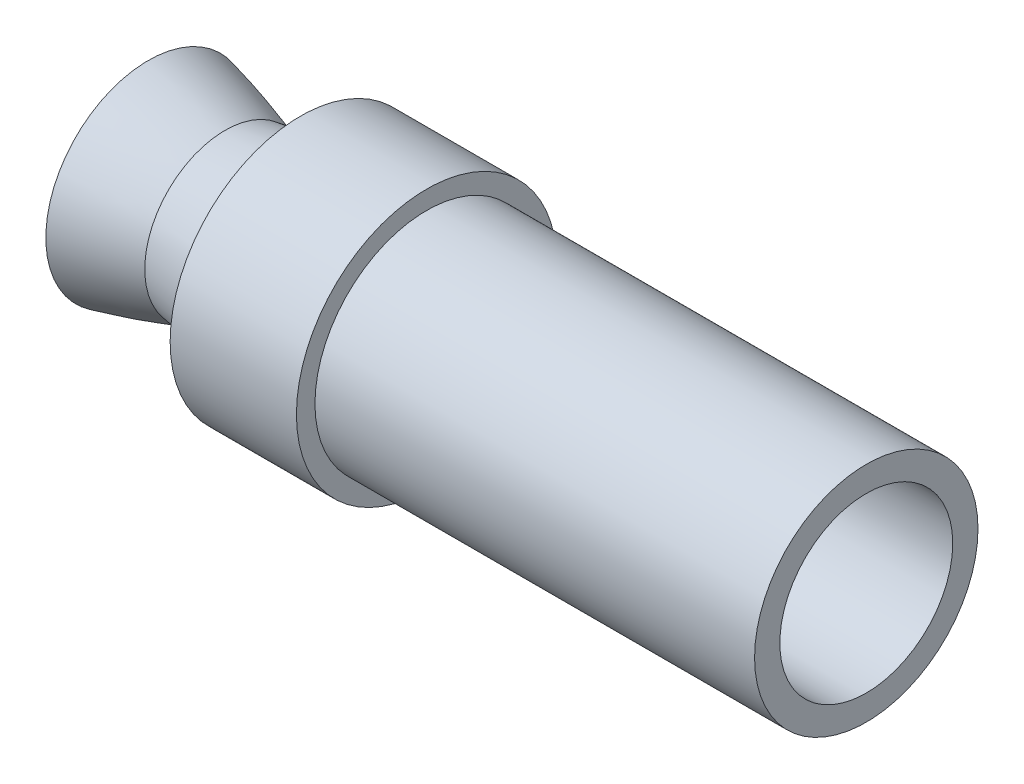
ISO-10303-21;
HEADER;
FILE_DESCRIPTION(('STEP AP214'),'2;1');
FILE_NAME('part.step','',(''),(''),'','','');
FILE_SCHEMA(('AUTOMOTIVE_DESIGN { 1 0 10303 214 1 1 1 1 }'));
ENDSEC;
DATA;
#1=APPLICATION_CONTEXT('core data for automotive mechanical design processes');
#2=APPLICATION_PROTOCOL_DEFINITION('international standard','automotive_design',2000,#1);
#3=PRODUCT_CONTEXT('',#1,'mechanical');
#4=PRODUCT('Part','Part','',(#3));
#5=PRODUCT_RELATED_PRODUCT_CATEGORY('part','',(#4));
#6=PRODUCT_DEFINITION_FORMATION('','',#4);
#7=PRODUCT_DEFINITION_CONTEXT('part definition',#1,'design');
#8=PRODUCT_DEFINITION('design','',#6,#7);
#9=PRODUCT_DEFINITION_SHAPE('','',#8);
#10=(LENGTH_UNIT() NAMED_UNIT(*) SI_UNIT(.MILLI.,.METRE.));
#11=(NAMED_UNIT(*) PLANE_ANGLE_UNIT() SI_UNIT($,.RADIAN.));
#12=(NAMED_UNIT(*) SI_UNIT($,.STERADIAN.) SOLID_ANGLE_UNIT());
#13=UNCERTAINTY_MEASURE_WITH_UNIT(LENGTH_MEASURE(1.E-05),#10,'distance_accuracy_value','');
#14=(GEOMETRIC_REPRESENTATION_CONTEXT(3) GLOBAL_UNCERTAINTY_ASSIGNED_CONTEXT((#13)) GLOBAL_UNIT_ASSIGNED_CONTEXT((#10,
#11,#12)) REPRESENTATION_CONTEXT('',''));
#15=CARTESIAN_POINT('',(0.,0.,0.));
#16=DIRECTION('',(0.,0.,1.));
#17=DIRECTION('',(1.,0.,0.));
#18=AXIS2_PLACEMENT_3D('',#15,#16,#17);
#19=CARTESIAN_POINT('',(28.9492369333014,0.,0.));
#20=DIRECTION('',(1.,0.,0.));
#21=DIRECTION('',(0.,0.,-1.));
#22=AXIS2_PLACEMENT_3D('',#19,#20,#21);
#23=DEGENERATE_TOROIDAL_SURFACE('',#22,17.3860040166505,18.,.T.);
#24=CARTESIAN_POINT('',(16.2213148719435,0.,0.));
#25=DIRECTION('',(1.,0.,0.));
#26=DIRECTION('',(0.,0.,-1.));
#27=AXIS2_PLACEMENT_3D('',#24,#25,#26);
#28=CIRCLE('',#27,30.1139260780083);
#29=CARTESIAN_POINT('',(16.2213148719435,0.,-30.1139260780083));
#30=VERTEX_POINT('',#29);
#31=EDGE_CURVE('E80',#30,#30,#28,.T.);
#32=ORIENTED_EDGE('',*,*,#31,.F.);
#33=EDGE_LOOP('',(#32));
#34=FACE_BOUND('',#33,.T.);
#35=CARTESIAN_POINT('',(28.9492369333014,0.,0.));
#36=DIRECTION('',(1.,0.,0.));
#37=DIRECTION('',(0.,0.,-1.));
#38=AXIS2_PLACEMENT_3D('',#35,#36,#37);
#39=CIRCLE('',#38,35.3860040166505);
#40=CARTESIAN_POINT('',(28.9492369333014,0.,-35.3860040166505));
#41=VERTEX_POINT('',#40);
#42=EDGE_CURVE('E11',#41,#41,#39,.T.);
#43=ORIENTED_EDGE('',*,*,#42,.T.);
#44=EDGE_LOOP('',(#43));
#45=FACE_BOUND('',#44,.T.);
#46=ADVANCED_FACE('F53',(#34,#45),#23,.F.);
#47=CARTESIAN_POINT('',(0.,0.,0.));
#48=DIRECTION('',(1.,0.,0.));
#49=DIRECTION('',(0.,0.,-1.));
#50=AXIS2_PLACEMENT_3D('',#47,#48,#49);
#51=CYLINDRICAL_SURFACE('',#50,35.3860040166505);
#52=ORIENTED_EDGE('',*,*,#42,.F.);
#53=EDGE_LOOP('',(#52));
#54=FACE_BOUND('',#53,.T.);
#55=CARTESIAN_POINT('',(49.8781691214359,0.,0.));
#56=DIRECTION('',(1.,0.,0.));
#57=DIRECTION('',(0.,0.,-1.));
#58=AXIS2_PLACEMENT_3D('',#55,#56,#57);
#59=CIRCLE('',#58,35.3860040166505);
#60=CARTESIAN_POINT('',(49.8781691214359,0.,-35.3860040166505));
#61=VERTEX_POINT('',#60);
#62=EDGE_CURVE('E60',#61,#61,#59,.T.);
#63=ORIENTED_EDGE('',*,*,#62,.T.);
#64=EDGE_LOOP('',(#63));
#65=FACE_BOUND('',#64,.T.);
#66=ADVANCED_FACE('F88',(#54,#65),#51,.F.);
#67=CARTESIAN_POINT('',(49.8781691214359,0.,0.));
#68=DIRECTION('',(-1.,0.,0.));
#69=DIRECTION('',(0.,0.,1.));
#70=AXIS2_PLACEMENT_3D('',#67,#68,#69);
#71=PLANE('',#70);
#72=ORIENTED_EDGE('',*,*,#62,.F.);
#73=EDGE_LOOP('',(#72));
#74=FACE_BOUND('',#73,.T.);
#75=CARTESIAN_POINT('',(49.8781691214359,0.,0.));
#76=DIRECTION('',(1.,0.,0.));
#77=DIRECTION('',(0.,0.,-1.));
#78=AXIS2_PLACEMENT_3D('',#75,#76,#77);
#79=CIRCLE('',#78,41.2499999999755);
#80=CARTESIAN_POINT('',(49.8781691214359,0.,-41.2499999999755));
#81=VERTEX_POINT('',#80);
#82=EDGE_CURVE('E65',#81,#81,#79,.T.);
#83=ORIENTED_EDGE('',*,*,#82,.T.);
#84=EDGE_LOOP('',(#83));
#85=FACE_BOUND('',#84,.T.);
#86=ADVANCED_FACE('F92',(#74,#85),#71,.F.);
#87=CARTESIAN_POINT('',(0.,0.,0.));
#88=DIRECTION('',(1.,0.,0.));
#89=DIRECTION('',(0.,0.,-1.));
#90=AXIS2_PLACEMENT_3D('',#87,#88,#89);
#91=CYLINDRICAL_SURFACE('',#90,41.2499999999755);
#92=ORIENTED_EDGE('',*,*,#82,.F.);
#93=EDGE_LOOP('',(#92));
#94=FACE_BOUND('',#93,.T.);
#95=CARTESIAN_POINT('',(9.87816912143587,0.,0.));
#96=DIRECTION('',(1.,0.,0.));
#97=DIRECTION('',(0.,0.,-1.));
#98=AXIS2_PLACEMENT_3D('',#95,#96,#97);
#99=CIRCLE('',#98,41.2499999999755);
#100=CARTESIAN_POINT('',(9.87816912143587,0.,-41.2499999999755));
#101=VERTEX_POINT('',#100);
#102=EDGE_CURVE('E70',#101,#101,#99,.T.);
#103=ORIENTED_EDGE('',*,*,#102,.T.);
#104=EDGE_LOOP('',(#103));
#105=FACE_BOUND('',#104,.T.);
#106=ADVANCED_FACE('F97',(#94,#105),#91,.T.);
#107=CARTESIAN_POINT('',(9.87816912143587,0.,0.));
#108=DIRECTION('',(1.,0.,0.));
#109=DIRECTION('',(0.,0.,-1.));
#110=AXIS2_PLACEMENT_3D('',#107,#108,#109);
#111=PLANE('',#110);
#112=ORIENTED_EDGE('',*,*,#102,.F.);
#113=EDGE_LOOP('',(#112));
#114=FACE_BOUND('',#113,.T.);
#115=CARTESIAN_POINT('',(9.87816912143588,0.,0.));
#116=DIRECTION('',(1.,0.,0.));
#117=DIRECTION('',(0.,0.,-1.));
#118=AXIS2_PLACEMENT_3D('',#115,#116,#117);
#119=CIRCLE('',#118,29.1318255412281);
#120=CARTESIAN_POINT('',(9.87816912143588,0.,-29.1318255412281));
#121=VERTEX_POINT('',#120);
#122=EDGE_CURVE('E76',#121,#121,#119,.T.);
#123=ORIENTED_EDGE('',*,*,#122,.T.);
#124=EDGE_LOOP('',(#123));
#125=FACE_BOUND('',#124,.T.);
#126=ADVANCED_FACE('F103',(#114,#125),#111,.F.);
#127=CARTESIAN_POINT('',(16.2213148719435,0.,0.));
#128=DIRECTION('',(1.,0.,0.));
#129=DIRECTION('',(0.,0.,-1.));
#130=AXIS2_PLACEMENT_3D('',#127,#128,#129);
#131=CONICAL_SURFACE('',#130,30.1139260780083,0.153608941783486);
#132=ORIENTED_EDGE('',*,*,#122,.F.);
#133=EDGE_LOOP('',(#132));
#134=FACE_BOUND('',#133,.T.);
#135=ORIENTED_EDGE('',*,*,#31,.T.);
#136=EDGE_LOOP('',(#135));
#137=FACE_BOUND('',#136,.T.);
#138=ADVANCED_FACE('F85',(#134,#137),#131,.F.);
#139=CLOSED_SHELL('',(#46,#66,#86,#106,#126,#138));
#140=MANIFOLD_SOLID_BREP('B2',#139);
#141=CARTESIAN_POINT('',(16.2213148719435,0.,0.));
#142=DIRECTION('',(1.,0.,0.));
#143=DIRECTION('',(0.,0.,-1.));
#144=AXIS2_PLACEMENT_3D('',#141,#142,#143);
#145=CONICAL_SURFACE('',#144,30.1139260780083,0.153608941783486);
#146=CARTESIAN_POINT('',(-13.9815869337929,0.,0.));
#147=DIRECTION('',(1.,0.,0.));
#148=DIRECTION('',(0.,0.,-1.));
#149=AXIS2_PLACEMENT_3D('',#146,#147,#148);
#150=CIRCLE('',#149,25.4376523106333);
#151=CARTESIAN_POINT('',(-13.9815869337929,0.,-25.4376523106333));
#152=VERTEX_POINT('',#151);
#153=EDGE_CURVE('E52',#152,#152,#150,.T.);
#154=ORIENTED_EDGE('',*,*,#153,.T.);
#155=EDGE_LOOP('',(#154));
#156=FACE_BOUND('',#155,.T.);
#157=CARTESIAN_POINT('',(16.2213148719435,0.,0.));
#158=DIRECTION('',(1.,0.,0.));
#159=DIRECTION('',(0.,0.,-1.));
#160=AXIS2_PLACEMENT_3D('',#157,#158,#159);
#161=CIRCLE('',#160,30.1139260780083);
#162=CARTESIAN_POINT('',(16.2213148719435,0.,-30.1139260780083));
#163=VERTEX_POINT('',#162);
#164=EDGE_CURVE('E202',#163,#163,#161,.T.);
#165=ORIENTED_EDGE('',*,*,#164,.F.);
#166=EDGE_LOOP('',(#165));
#167=FACE_BOUND('',#166,.T.);
#168=ADVANCED_FACE('F162',(#156,#167),#145,.T.);
#169=CARTESIAN_POINT('',(2.34818467411675,19.2267693994655,0.));
#170=CARTESIAN_POINT('',(0.31354563692423,20.0775060385211,0.));
#171=CARTESIAN_POINT('',(-5.8002726091552,22.5182343127452,0.));
#172=CARTESIAN_POINT('',(-13.9783879953932,25.4749777747112,0.));
#173=CARTESIAN_POINT('',(-28.1601907718546,30.0701216733316,0.));
#174=CARTESIAN_POINT('',(-38.3150228285927,32.4320922392603,0.));
#175=B_SPLINE_CURVE_WITH_KNOTS('',2,(#169,#170,#171,#172,#173,#174),.UNSPECIFIED.,.F.,.F.,(3,1,
1,1,3),(0.018493807027929,0.117487589472404,0.315475154361354,0.513462719250305,1.),.UNSPECIFIED.);
#176=CARTESIAN_POINT('',(0.,0.,0.));
#177=DIRECTION('',(1.,0.,0.));
#178=AXIS1_PLACEMENT('',#176,#177);
#179=SURFACE_OF_REVOLUTION('',#175,#178);
#180=CARTESIAN_POINT('',(-38.3150228285927,0.,0.));
#181=DIRECTION('',(1.,0.,0.));
#182=DIRECTION('',(0.,0.,-1.));
#183=AXIS2_PLACEMENT_3D('',#180,#181,#182);
#184=CIRCLE('',#183,32.4320922392603);
#185=CARTESIAN_POINT('',(-38.3150228285927,0.,-32.4320922392603));
#186=VERTEX_POINT('',#185);
#187=EDGE_CURVE('E168',#186,#186,#184,.T.);
#188=ORIENTED_EDGE('',*,*,#187,.T.);
#189=EDGE_LOOP('',(#188));
#190=FACE_BOUND('',#189,.T.);
#191=ORIENTED_EDGE('',*,*,#153,.F.);
#192=EDGE_LOOP('',(#191));
#193=FACE_BOUND('',#192,.T.);
#194=ADVANCED_FACE('F225',(#190,#193),#179,.F.);
#195=CARTESIAN_POINT('',(-40.1270102829806,0.,0.));
#196=DIRECTION('',(1.,0.,0.));
#197=DIRECTION('',(0.,0.,-1.));
#198=AXIS2_PLACEMENT_3D('',#195,#196,#197);
#199=CONICAL_SURFACE('',#198,24.64,1.34231515229828);
#200=ORIENTED_EDGE('',*,*,#187,.F.);
#201=EDGE_LOOP('',(#200));
#202=FACE_BOUND('',#201,.T.);
#203=CARTESIAN_POINT('',(-40.1270102829806,0.,0.));
#204=DIRECTION('',(1.,0.,0.));
#205=DIRECTION('',(0.,0.,-1.));
#206=AXIS2_PLACEMENT_3D('',#203,#204,#205);
#207=CIRCLE('',#206,24.64);
#208=CARTESIAN_POINT('',(-40.1270102829806,0.,-24.64));
#209=VERTEX_POINT('',#208);
#210=EDGE_CURVE('E172',#209,#209,#207,.T.);
#211=ORIENTED_EDGE('',*,*,#210,.T.);
#212=EDGE_LOOP('',(#211));
#213=FACE_BOUND('',#212,.T.);
#214=ADVANCED_FACE('F221',(#202,#213),#199,.T.);
#215=CARTESIAN_POINT('',(0.,11.5361374682942,0.));
#216=CARTESIAN_POINT('',(-19.9482573544596,19.9475956971547,0.));
#217=CARTESIAN_POINT('',(-40.1270102829806,24.64,0.));
#218=B_SPLINE_CURVE_WITH_KNOTS('',2,(#215,#216,#217),.UNSPECIFIED.,.F.,.F.,(3,3),(0.,1.),.UNSPECIFIED.);
#219=CARTESIAN_POINT('',(0.,0.,0.));
#220=DIRECTION('',(1.,0.,0.));
#221=AXIS1_PLACEMENT('',#219,#220);
#222=SURFACE_OF_REVOLUTION('',#218,#221);
#223=ORIENTED_EDGE('',*,*,#210,.F.);
#224=EDGE_LOOP('',(#223));
#225=FACE_BOUND('',#224,.T.);
#226=CARTESIAN_POINT('',(0.,0.,0.));
#227=DIRECTION('',(1.,0.,0.));
#228=DIRECTION('',(0.,0.,-1.));
#229=AXIS2_PLACEMENT_3D('',#226,#227,#228);
#230=CIRCLE('',#229,11.5361374682942);
#231=CARTESIAN_POINT('',(0.,0.,-11.5361374682942));
#232=VERTEX_POINT('',#231);
#233=EDGE_CURVE('E176',#232,#232,#230,.T.);
#234=ORIENTED_EDGE('',*,*,#233,.T.);
#235=EDGE_LOOP('',(#234));
#236=FACE_BOUND('',#235,.T.);
#237=ADVANCED_FACE('F216',(#225,#236),#222,.T.);
#238=CARTESIAN_POINT('',(1.66230944505193,0.,0.));
#239=DIRECTION('',(1.,0.,0.));
#240=DIRECTION('',(0.,0.,-1.));
#241=AXIS2_PLACEMENT_3D('',#238,#239,#240);
#242=TOROIDAL_SURFACE('',#241,15.4784,4.2784);
#243=ORIENTED_EDGE('',*,*,#233,.F.);
#244=EDGE_LOOP('',(#243));
#245=FACE_BOUND('',#244,.T.);
#246=CARTESIAN_POINT('',(1.66230944505193,0.,0.));
#247=DIRECTION('',(1.,0.,0.));
#248=DIRECTION('',(0.,0.,-1.));
#249=AXIS2_PLACEMENT_3D('',#246,#247,#248);
#250=CIRCLE('',#249,11.2);
#251=CARTESIAN_POINT('',(1.66230944505193,0.,-11.2));
#252=VERTEX_POINT('',#251);
#253=EDGE_CURVE('E181',#252,#252,#250,.T.);
#254=ORIENTED_EDGE('',*,*,#253,.T.);
#255=EDGE_LOOP('',(#254));
#256=FACE_BOUND('',#255,.T.);
#257=ADVANCED_FACE('F220',(#245,#256),#242,.T.);
#258=CARTESIAN_POINT('',(1.66230944505193,0.,0.));
#259=DIRECTION('',(1.,0.,0.));
#260=DIRECTION('',(0.,0.,-1.));
#261=AXIS2_PLACEMENT_3D('',#258,#259,#260);
#262=TOROIDAL_SURFACE('',#261,28.,16.8);
#263=ORIENTED_EDGE('',*,*,#253,.F.);
#264=EDGE_LOOP('',(#263));
#265=FACE_BOUND('',#264,.T.);
#266=CARTESIAN_POINT('',(13.5417033689859,0.,0.));
#267=DIRECTION('',(1.,0.,0.));
#268=DIRECTION('',(0.,0.,-1.));
#269=AXIS2_PLACEMENT_3D('',#266,#267,#268);
#270=CIRCLE('',#269,16.120606076066);
#271=CARTESIAN_POINT('',(13.5417033689859,0.,-16.120606076066));
#272=VERTEX_POINT('',#271);
#273=EDGE_CURVE('E184',#272,#272,#270,.T.);
#274=ORIENTED_EDGE('',*,*,#273,.T.);
#275=EDGE_LOOP('',(#274));
#276=FACE_BOUND('',#275,.T.);
#277=ADVANCED_FACE('F269',(#265,#276),#262,.T.);
#278=CARTESIAN_POINT('',(21.8781691214359,0.,0.));
#279=DIRECTION('',(1.,0.,0.));
#280=DIRECTION('',(0.,0.,-1.));
#281=AXIS2_PLACEMENT_3D('',#278,#279,#280);
#282=CONICAL_SURFACE('',#281,24.457071828516,0.785398163397449);
#283=ORIENTED_EDGE('',*,*,#273,.F.);
#284=EDGE_LOOP('',(#283));
#285=FACE_BOUND('',#284,.T.);
#286=CARTESIAN_POINT('',(21.8781691214359,0.,0.));
#287=DIRECTION('',(1.,0.,0.));
#288=DIRECTION('',(0.,0.,-1.));
#289=AXIS2_PLACEMENT_3D('',#286,#287,#288);
#290=CIRCLE('',#289,24.457071828516);
#291=CARTESIAN_POINT('',(21.8781691214359,0.,-24.457071828516));
#292=VERTEX_POINT('',#291);
#293=EDGE_CURVE('E187',#292,#292,#290,.T.);
#294=ORIENTED_EDGE('',*,*,#293,.T.);
#295=EDGE_LOOP('',(#294));
#296=FACE_BOUND('',#295,.T.);
#297=ADVANCED_FACE('F263',(#285,#296),#282,.F.);
#298=CARTESIAN_POINT('',(28.9492369333014,0.,0.));
#299=DIRECTION('',(1.,0.,0.));
#300=DIRECTION('',(0.,0.,-1.));
#301=AXIS2_PLACEMENT_3D('',#298,#299,#300);
#302=TOROIDAL_SURFACE('',#301,17.3860040166505,10.);
#303=ORIENTED_EDGE('',*,*,#293,.F.);
#304=EDGE_LOOP('',(#303));
#305=FACE_BOUND('',#304,.T.);
#306=CARTESIAN_POINT('',(28.9492369333014,0.,0.));
#307=DIRECTION('',(1.,0.,0.));
#308=DIRECTION('',(0.,0.,-1.));
#309=AXIS2_PLACEMENT_3D('',#306,#307,#308);
#310=CIRCLE('',#309,27.3860040166505);
#311=CARTESIAN_POINT('',(28.9492369333014,0.,-27.3860040166505));
#312=VERTEX_POINT('',#311);
#313=EDGE_CURVE('E190',#312,#312,#310,.T.);
#314=ORIENTED_EDGE('',*,*,#313,.T.);
#315=EDGE_LOOP('',(#314));
#316=FACE_BOUND('',#315,.T.);
#317=ADVANCED_FACE('F257',(#305,#316),#302,.F.);
#318=CARTESIAN_POINT('',(0.,0.,0.));
#319=DIRECTION('',(1.,0.,0.));
#320=DIRECTION('',(0.,0.,-1.));
#321=AXIS2_PLACEMENT_3D('',#318,#319,#320);
#322=CYLINDRICAL_SURFACE('',#321,27.3860040166505);
#323=ORIENTED_EDGE('',*,*,#313,.F.);
#324=EDGE_LOOP('',(#323));
#325=FACE_BOUND('',#324,.T.);
#326=CARTESIAN_POINT('',(189.133015330605,0.,0.));
#327=DIRECTION('',(1.,0.,0.));
#328=DIRECTION('',(0.,0.,-1.));
#329=AXIS2_PLACEMENT_3D('',#326,#327,#328);
#330=CIRCLE('',#329,27.3860040166505);
#331=CARTESIAN_POINT('',(189.133015330605,0.,-27.3860040166505));
#332=VERTEX_POINT('',#331);
#333=EDGE_CURVE('E193',#332,#332,#330,.T.);
#334=ORIENTED_EDGE('',*,*,#333,.T.);
#335=EDGE_LOOP('',(#334));
#336=FACE_BOUND('',#335,.T.);
#337=ADVANCED_FACE('F252',(#325,#336),#322,.F.);
#338=CARTESIAN_POINT('',(189.133015330605,0.,0.));
#339=DIRECTION('',(1.,0.,0.));
#340=DIRECTION('',(0.,0.,-1.));
#341=AXIS2_PLACEMENT_3D('',#338,#339,#340);
#342=PLANE('',#341);
#343=CARTESIAN_POINT('',(189.133015330605,0.,0.));
#344=DIRECTION('',(1.,0.,0.));
#345=DIRECTION('',(0.,0.,-1.));
#346=AXIS2_PLACEMENT_3D('',#343,#344,#345);
#347=CIRCLE('',#346,35.3860040166505);
#348=CARTESIAN_POINT('',(189.133015330605,0.,-35.3860040166505));
#349=VERTEX_POINT('',#348);
#350=EDGE_CURVE('E196',#349,#349,#347,.T.);
#351=ORIENTED_EDGE('',*,*,#350,.T.);
#352=EDGE_LOOP('',(#351));
#353=FACE_BOUND('',#352,.T.);
#354=ORIENTED_EDGE('',*,*,#333,.F.);
#355=EDGE_LOOP('',(#354));
#356=FACE_BOUND('',#355,.T.);
#357=ADVANCED_FACE('F246',(#353,#356),#342,.T.);
#358=CARTESIAN_POINT('',(0.,0.,0.));
#359=DIRECTION('',(1.,0.,0.));
#360=DIRECTION('',(0.,0.,-1.));
#361=AXIS2_PLACEMENT_3D('',#358,#359,#360);
#362=CYLINDRICAL_SURFACE('',#361,35.3860040166505);
#363=CARTESIAN_POINT('',(28.9492369333014,0.,0.));
#364=DIRECTION('',(1.,0.,0.));
#365=DIRECTION('',(0.,0.,-1.));
#366=AXIS2_PLACEMENT_3D('',#363,#364,#365);
#367=CIRCLE('',#366,35.3860040166505);
#368=CARTESIAN_POINT('',(28.9492369333014,0.,-35.3860040166505));
#369=VERTEX_POINT('',#368);
#370=EDGE_CURVE('E199',#369,#369,#367,.T.);
#371=ORIENTED_EDGE('',*,*,#370,.T.);
#372=EDGE_LOOP('',(#371));
#373=FACE_BOUND('',#372,.T.);
#374=ORIENTED_EDGE('',*,*,#350,.F.);
#375=EDGE_LOOP('',(#374));
#376=FACE_BOUND('',#375,.T.);
#377=ADVANCED_FACE('F240',(#373,#376),#362,.T.);
#378=CARTESIAN_POINT('',(28.9492369333014,0.,0.));
#379=DIRECTION('',(1.,0.,0.));
#380=DIRECTION('',(0.,0.,-1.));
#381=AXIS2_PLACEMENT_3D('',#378,#379,#380);
#382=DEGENERATE_TOROIDAL_SURFACE('',#381,17.3860040166505,18.,.T.);
#383=ORIENTED_EDGE('',*,*,#164,.T.);
#384=EDGE_LOOP('',(#383));
#385=FACE_BOUND('',#384,.T.);
#386=ORIENTED_EDGE('',*,*,#370,.F.);
#387=EDGE_LOOP('',(#386));
#388=FACE_BOUND('',#387,.T.);
#389=ADVANCED_FACE('F237',(#385,#388),#382,.T.);
#390=CLOSED_SHELL('',(#168,#194,#214,#237,#257,#277,#297,#317,#337,#357,#377,#389));
#391=MANIFOLD_SOLID_BREP('B6_NOT_SHOWN',#390);
#392=ADVANCED_BREP_SHAPE_REPRESENTATION('',(#18,#140,#391),#14);
#393=SHAPE_DEFINITION_REPRESENTATION(#9,#392);
ENDSEC;
END-ISO-10303-21;
